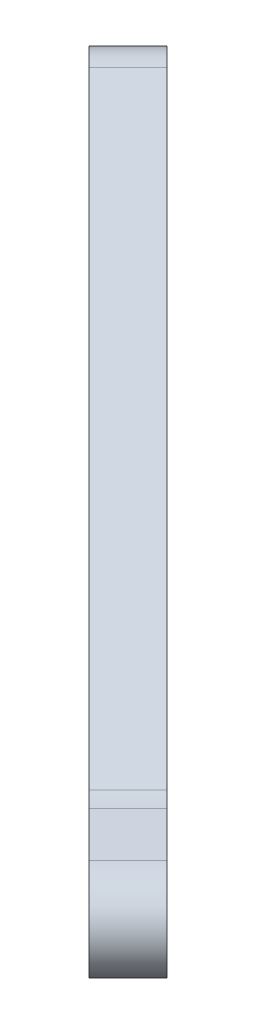
ISO-10303-21;
HEADER;
FILE_DESCRIPTION(('STEP AP214'),'2;1');
FILE_NAME('part.step','',(''),(''),'','','');
FILE_SCHEMA(('AUTOMOTIVE_DESIGN { 1 0 10303 214 1 1 1 1 }'));
ENDSEC;
DATA;
#1=APPLICATION_CONTEXT('core data for automotive mechanical design processes');
#2=APPLICATION_PROTOCOL_DEFINITION('international standard','automotive_design',2000,#1);
#3=PRODUCT_CONTEXT('',#1,'mechanical');
#4=PRODUCT('Part','Part','',(#3));
#5=PRODUCT_RELATED_PRODUCT_CATEGORY('part','',(#4));
#6=PRODUCT_DEFINITION_FORMATION('','',#4);
#7=PRODUCT_DEFINITION_CONTEXT('part definition',#1,'design');
#8=PRODUCT_DEFINITION('design','',#6,#7);
#9=PRODUCT_DEFINITION_SHAPE('','',#8);
#10=(LENGTH_UNIT() NAMED_UNIT(*) SI_UNIT(.MILLI.,.METRE.));
#11=(NAMED_UNIT(*) PLANE_ANGLE_UNIT() SI_UNIT($,.RADIAN.));
#12=(NAMED_UNIT(*) SI_UNIT($,.STERADIAN.) SOLID_ANGLE_UNIT());
#13=UNCERTAINTY_MEASURE_WITH_UNIT(LENGTH_MEASURE(1.E-05),#10,'distance_accuracy_value','');
#14=(GEOMETRIC_REPRESENTATION_CONTEXT(3) GLOBAL_UNCERTAINTY_ASSIGNED_CONTEXT((#13)) GLOBAL_UNIT_ASSIGNED_CONTEXT((#10,
#11,#12)) REPRESENTATION_CONTEXT('',''));
#15=CARTESIAN_POINT('',(0.,0.,0.));
#16=DIRECTION('',(0.,0.,1.));
#17=DIRECTION('',(1.,0.,0.));
#18=AXIS2_PLACEMENT_3D('',#15,#16,#17);
#19=CARTESIAN_POINT('',(-52.7599580016663,-1.60288568297003,29.4826826854525));
#20=DIRECTION('',(0.707106781186551,0.,-0.707106781186544));
#21=DIRECTION('',(-0.707106781186544,0.,-0.707106781186551));
#22=AXIS2_PLACEMENT_3D('',#19,#20,#21);
#23=CYLINDRICAL_SURFACE('',#22,4.);
#24=CARTESIAN_POINT('',(-50.6386376581066,-1.60288568297003,27.3613623418928));
#25=DIRECTION('',(0.707106781186551,0.,-0.707106781186544));
#26=DIRECTION('',(-0.707106781186544,0.,-0.707106781186551));
#27=AXIS2_PLACEMENT_3D('',#24,#25,#26);
#28=CIRCLE('',#27,4.);
#29=CARTESIAN_POINT('',(-52.1460159613578,1.78172970164536,25.8539840386417));
#30=VERTEX_POINT('',#29);
#31=CARTESIAN_POINT('',(-48.4679129448013,0.961467732238384,29.5320870551982));
#32=VERTEX_POINT('',#31);
#33=EDGE_CURVE('E155',#30,#32,#28,.T.);
#34=ORIENTED_EDGE('',*,*,#33,.T.);
#35=DIRECTION('',(0.707106781186551,0.,-0.707106781186544));
#36=VECTOR('',#35,1.);
#37=CARTESIAN_POINT('',(-50.589233288361,0.961467732238385,31.6534073987578));
#38=LINE('',#37,#36);
#39=CARTESIAN_POINT('',(-50.589233288361,0.961467732238385,31.6534073987578));
#40=VERTEX_POINT('',#39);
#41=EDGE_CURVE('E53',#32,#40,#38,.F.);
#42=ORIENTED_EDGE('',*,*,#41,.T.);
#43=CARTESIAN_POINT('',(-52.7599580016663,-1.60288568297003,29.4826826854525));
#44=DIRECTION('',(0.707106781186551,0.,-0.707106781186544));
#45=DIRECTION('',(-0.707106781186544,0.,-0.707106781186551));
#46=AXIS2_PLACEMENT_3D('',#43,#44,#45);
#47=CIRCLE('',#46,4.);
#48=CARTESIAN_POINT('',(-54.2673363049174,1.78172970164536,27.9753043822013));
#49=VERTEX_POINT('',#48);
#50=EDGE_CURVE('E128',#49,#40,#47,.T.);
#51=ORIENTED_EDGE('',*,*,#50,.F.);
#52=DIRECTION('',(0.707106781186551,0.,-0.707106781186544));
#53=VECTOR('',#52,1.);
#54=CARTESIAN_POINT('',(-54.2673363049174,1.78172970164536,27.9753043822013));
#55=LINE('',#54,#53);
#56=EDGE_CURVE('E117',#49,#30,#55,.T.);
#57=ORIENTED_EDGE('',*,*,#56,.T.);
#58=EDGE_LOOP('',(#34,#42,#51,#57));
#59=FACE_BOUND('',#58,.T.);
#60=ADVANCED_FACE('F38',(#59),#23,.F.);
#61=CARTESIAN_POINT('',(-41.5774177938016,-2.92069575510476,40.6652228933173));
#62=DIRECTION('',(-0.152486267652241,-0.976471134419742,-0.152486267652242));
#63=DIRECTION('',(0.,0.154290605331928,-0.988025510351988));
#64=AXIS2_PLACEMENT_3D('',#61,#62,#63);
#65=PLANE('',#64);
#66=DIRECTION('',(-0.690469360781117,0.215648147789453,-0.690469360781124));
#67=VECTOR('',#66,1.);
#68=CARTESIAN_POINT('',(-39.4560974502419,-2.92069575510476,38.5439025497577));
#69=LINE('',#68,#67);
#70=CARTESIAN_POINT('',(-26.7715239050535,-6.88235567209871,51.2284760949462));
#71=VERTEX_POINT('',#70);
#72=CARTESIAN_POINT('',(-46.5169383914309,-0.715446170849808,31.4830616085686));
#73=VERTEX_POINT('',#72);
#74=EDGE_CURVE('E169',#71,#73,#69,.T.);
#75=ORIENTED_EDGE('',*,*,#74,.F.);
#76=DIRECTION('',(0.707106781186551,0.,-0.707106781186544));
#77=VECTOR('',#76,1.);
#78=CARTESIAN_POINT('',(-28.8928442486132,-6.88235567209871,53.3497964385059));
#79=LINE('',#78,#77);
#80=CARTESIAN_POINT('',(-28.8928442486132,-6.88235567209871,53.3497964385059));
#81=VERTEX_POINT('',#80);
#82=EDGE_CURVE('E197',#71,#81,#79,.F.);
#83=ORIENTED_EDGE('',*,*,#82,.T.);
#84=DIRECTION('',(-0.690469360781117,0.215648147789453,-0.690469360781124));
#85=VECTOR('',#84,1.);
#86=CARTESIAN_POINT('',(-41.5774177938016,-2.92069575510476,40.6652228933173));
#87=LINE('',#86,#85);
#88=CARTESIAN_POINT('',(-48.6382587349905,-0.715446170849808,33.6043819521283));
#89=VERTEX_POINT('',#88);
#90=EDGE_CURVE('E148',#81,#89,#87,.T.);
#91=ORIENTED_EDGE('',*,*,#90,.T.);
#92=DIRECTION('',(-0.707106781186551,0.,0.707106781186544));
#93=VECTOR('',#92,1.);
#94=CARTESIAN_POINT('',(-46.5169383914309,-0.71544617084981,31.4830616085686));
#95=LINE('',#94,#93);
#96=EDGE_CURVE('E194',#89,#73,#95,.F.);
#97=ORIENTED_EDGE('',*,*,#96,.T.);
#98=EDGE_LOOP('',(#75,#83,#91,#97));
#99=FACE_BOUND('',#98,.T.);
#100=ADVANCED_FACE('F223',(#99),#65,.T.);
#101=CARTESIAN_POINT('',(-41.1213203435597,-7.,41.1213203435592));
#102=DIRECTION('',(0.,-1.,0.));
#103=DIRECTION('',(0.,0.,-1.));
#104=AXIS2_PLACEMENT_3D('',#101,#102,#103);
#105=PLANE('',#104);
#106=DIRECTION('',(-0.707106781186544,0.,-0.707106781186551));
#107=VECTOR('',#106,1.);
#108=CARTESIAN_POINT('',(-41.1213203435597,-7.,41.1213203435592));
#109=LINE('',#108,#107);
#110=CARTESIAN_POINT('',(-25.6877396299112,-7.,56.5549010572078));
#111=VERTEX_POINT('',#110);
#112=CARTESIAN_POINT('',(-28.130412910352,-7.,54.1122277767671));
#113=VERTEX_POINT('',#112);
#114=EDGE_CURVE('E145',#111,#113,#109,.T.);
#115=ORIENTED_EDGE('',*,*,#114,.T.);
#116=DIRECTION('',(0.707106781186551,0.,-0.707106781186544));
#117=VECTOR('',#116,1.);
#118=CARTESIAN_POINT('',(-28.130412910352,-7.,54.1122277767671));
#119=LINE('',#118,#117);
#120=CARTESIAN_POINT('',(-26.0090925667923,-7.,51.9909074332074));
#121=VERTEX_POINT('',#120);
#122=EDGE_CURVE('E187',#113,#121,#119,.T.);
#123=ORIENTED_EDGE('',*,*,#122,.T.);
#124=DIRECTION('',(-0.707106781186544,0.,-0.707106781186551));
#125=VECTOR('',#124,1.);
#126=CARTESIAN_POINT('',(-39.,-7.,38.9999999999996));
#127=LINE('',#126,#125);
#128=CARTESIAN_POINT('',(-23.5664192863516,-7.,54.4335807136482));
#129=VERTEX_POINT('',#128);
#130=EDGE_CURVE('E166',#129,#121,#127,.T.);
#131=ORIENTED_EDGE('',*,*,#130,.F.);
#132=DIRECTION('',(0.707106781186551,0.,-0.707106781186544));
#133=VECTOR('',#132,1.);
#134=CARTESIAN_POINT('',(-25.6877396299112,-7.,56.5549010572078));
#135=LINE('',#134,#133);
#136=EDGE_CURVE('E177',#111,#129,#135,.T.);
#137=ORIENTED_EDGE('',*,*,#136,.F.);
#138=EDGE_LOOP('',(#115,#123,#131,#137));
#139=FACE_BOUND('',#138,.T.);
#140=ADVANCED_FACE('F231',(#139),#105,.T.);
#141=CARTESIAN_POINT('',(-25.6877396299112,-4.5,56.5549010572078));
#142=DIRECTION('',(0.707106781186551,0.,-0.707106781186544));
#143=DIRECTION('',(-0.707106781186544,0.,-0.707106781186551));
#144=AXIS2_PLACEMENT_3D('',#141,#142,#143);
#145=CYLINDRICAL_SURFACE('',#144,2.5);
#146=CARTESIAN_POINT('',(-23.5664192863516,-4.5,54.4335807136482));
#147=DIRECTION('',(0.707106781186551,0.,-0.707106781186544));
#148=DIRECTION('',(-0.707106781186544,0.,-0.707106781186551));
#149=AXIS2_PLACEMENT_3D('',#146,#147,#148);
#150=CIRCLE('',#149,2.5);
#151=CARTESIAN_POINT('',(-23.5664192863516,-2.,54.4335807136482));
#152=VERTEX_POINT('',#151);
#153=EDGE_CURVE('E163',#152,#129,#150,.T.);
#154=ORIENTED_EDGE('',*,*,#153,.F.);
#155=DIRECTION('',(0.707106781186551,0.,-0.707106781186544));
#156=VECTOR('',#155,1.);
#157=CARTESIAN_POINT('',(-25.6877396299112,-2.,56.5549010572078));
#158=LINE('',#157,#156);
#159=CARTESIAN_POINT('',(-25.6877396299112,-2.,56.5549010572078));
#160=VERTEX_POINT('',#159);
#161=EDGE_CURVE('E180',#160,#152,#158,.T.);
#162=ORIENTED_EDGE('',*,*,#161,.F.);
#163=CARTESIAN_POINT('',(-25.6877396299112,-4.5,56.5549010572078));
#164=DIRECTION('',(0.707106781186551,0.,-0.707106781186544));
#165=DIRECTION('',(-0.707106781186544,0.,-0.707106781186551));
#166=AXIS2_PLACEMENT_3D('',#163,#164,#165);
#167=CIRCLE('',#166,2.5);
#168=EDGE_CURVE('E142',#160,#111,#167,.T.);
#169=ORIENTED_EDGE('',*,*,#168,.T.);
#170=ORIENTED_EDGE('',*,*,#136,.T.);
#171=EDGE_LOOP('',(#154,#162,#169,#170));
#172=FACE_BOUND('',#171,.T.);
#173=ADVANCED_FACE('F234',(#172),#145,.T.);
#174=CARTESIAN_POINT('',(-41.1213203435597,-2.,41.1213203435592));
#175=DIRECTION('',(0.,-1.,0.));
#176=DIRECTION('',(0.,0.,-1.));
#177=AXIS2_PLACEMENT_3D('',#174,#175,#176);
#178=PLANE('',#177);
#179=DIRECTION('',(-0.707106781186544,0.,-0.707106781186551));
#180=VECTOR('',#179,1.);
#181=CARTESIAN_POINT('',(-39.,-2.,38.9999999999996));
#182=LINE('',#181,#180);
#183=CARTESIAN_POINT('',(-26.003572491512,-2.,51.9964275084878));
#184=VERTEX_POINT('',#183);
#185=EDGE_CURVE('E160',#152,#184,#182,.T.);
#186=ORIENTED_EDGE('',*,*,#185,.T.);
#187=DIRECTION('',(0.707106781186551,0.,-0.707106781186544));
#188=VECTOR('',#187,1.);
#189=CARTESIAN_POINT('',(-28.1248928350716,-2.,54.1177478520474));
#190=LINE('',#189,#188);
#191=CARTESIAN_POINT('',(-28.1248928350716,-2.,54.1177478520474));
#192=VERTEX_POINT('',#191);
#193=EDGE_CURVE('E185',#184,#192,#190,.F.);
#194=ORIENTED_EDGE('',*,*,#193,.T.);
#195=DIRECTION('',(-0.707106781186544,0.,-0.707106781186551));
#196=VECTOR('',#195,1.);
#197=CARTESIAN_POINT('',(-41.1213203435597,-2.,41.1213203435592));
#198=LINE('',#197,#196);
#199=EDGE_CURVE('E137',#160,#192,#198,.T.);
#200=ORIENTED_EDGE('',*,*,#199,.F.);
#201=ORIENTED_EDGE('',*,*,#161,.T.);
#202=EDGE_LOOP('',(#186,#194,#200,#201));
#203=FACE_BOUND('',#202,.T.);
#204=ADVANCED_FACE('F212',(#203),#178,.F.);
#205=CARTESIAN_POINT('',(-40.8203896056377,1.89921329401667,41.4222510814812));
#206=DIRECTION('',(-0.154615890785117,-0.975801133752902,-0.154615890785118));
#207=DIRECTION('',(0.,0.156497830604243,-0.987678302392113));
#208=AXIS2_PLACEMENT_3D('',#205,#206,#207);
#209=PLANE('',#208);
#210=DIRECTION('',(-0.689995598766195,0.21865988970671,-0.689995598766202));
#211=VECTOR('',#210,1.);
#212=CARTESIAN_POINT('',(-40.8203896056377,1.89921329401667,41.4222510814812));
#213=LINE('',#212,#211);
#214=CARTESIAN_POINT('',(-28.8979722889972,-1.87900566876451,53.3446683981218));
#215=VERTEX_POINT('',#214);
#216=CARTESIAN_POINT('',(-54.8229080174867,6.33661715141222,27.4197326696321));
#217=VERTEX_POINT('',#216);
#218=EDGE_CURVE('E134',#215,#217,#213,.T.);
#219=ORIENTED_EDGE('',*,*,#218,.F.);
#220=DIRECTION('',(0.707106781186551,0.,-0.707106781186544));
#221=VECTOR('',#220,1.);
#222=CARTESIAN_POINT('',(-26.7766519454375,-1.87900566876451,51.2233480545622));
#223=LINE('',#222,#221);
#224=CARTESIAN_POINT('',(-26.7766519454376,-1.87900566876451,51.2233480545622));
#225=VERTEX_POINT('',#224);
#226=EDGE_CURVE('E179',#215,#225,#223,.T.);
#227=ORIENTED_EDGE('',*,*,#226,.T.);
#228=DIRECTION('',(-0.689995598766195,0.21865988970671,-0.689995598766202));
#229=VECTOR('',#228,1.);
#230=CARTESIAN_POINT('',(-38.6990692620781,1.89921329401667,39.3009307379215));
#231=LINE('',#230,#229);
#232=CARTESIAN_POINT('',(-52.701587673927,6.33661715141222,25.2984123260724));
#233=VERTEX_POINT('',#232);
#234=EDGE_CURVE('E158',#225,#233,#231,.T.);
#235=ORIENTED_EDGE('',*,*,#234,.T.);
#236=DIRECTION('',(0.707106781186551,0.,-0.707106781186544));
#237=VECTOR('',#236,1.);
#238=CARTESIAN_POINT('',(-54.8229080174867,6.33661715141222,27.4197326696321));
#239=LINE('',#238,#237);
#240=EDGE_CURVE('E125',#217,#233,#239,.T.);
#241=ORIENTED_EDGE('',*,*,#240,.F.);
#242=EDGE_LOOP('',(#219,#227,#235,#241));
#243=FACE_BOUND('',#242,.T.);
#244=ADVANCED_FACE('F218',(#243),#209,.F.);
#245=CARTESIAN_POINT('',(-25.6877396299112,-4.5,56.5549010572078));
#246=DIRECTION('',(0.707106781186551,0.,-0.707106781186544));
#247=DIRECTION('',(-0.707106781186544,0.,-0.707106781186551));
#248=AXIS2_PLACEMENT_3D('',#245,#246,#247);
#249=CYLINDRICAL_SURFACE('',#248,1.);
#250=CARTESIAN_POINT('',(-25.6877396299112,-4.5,56.5549010572078));
#251=DIRECTION('',(0.707106781186551,0.,-0.707106781186544));
#252=DIRECTION('',(-0.707106781186544,0.,-0.707106781186551));
#253=AXIS2_PLACEMENT_3D('',#250,#251,#252);
#254=CIRCLE('',#253,1.);
#255=CARTESIAN_POINT('',(-26.3948464110978,-4.5,55.8477942760212));
#256=VERTEX_POINT('',#255);
#257=EDGE_CURVE('E150',#256,#256,#254,.T.);
#258=CARTESIAN_POINT('',(-23.5664192863516,-4.5,54.4335807136482));
#259=DIRECTION('',(0.707106781186551,0.,-0.707106781186544));
#260=DIRECTION('',(-0.707106781186544,0.,-0.707106781186551));
#261=AXIS2_PLACEMENT_3D('',#258,#259,#260);
#262=CIRCLE('',#261,1.);
#263=CARTESIAN_POINT('',(-24.2735260675381,-4.5,53.7264739324616));
#264=VERTEX_POINT('',#263);
#265=EDGE_CURVE('E172',#264,#264,#262,.T.);
#266=CARTESIAN_POINT('',(-26.3948464110978,-4.5,55.8477942760212));
#267=CARTESIAN_POINT('',(-26.3727493241857,-4.5,55.8256971891092));
#268=CARTESIAN_POINT('',(-26.3506522372736,-4.5,55.8036001021971));
#269=CARTESIAN_POINT('',(-26.3064580634495,-4.5,55.7594059283729));
#270=CARTESIAN_POINT('',(-26.2843609765374,-4.5,55.7373088414609));
#271=CARTESIAN_POINT('',(-26.2401668027132,-4.5,55.6931146676367));
#272=CARTESIAN_POINT('',(-26.2180697158011,-4.5,55.6710175807246));
#273=CARTESIAN_POINT('',(-26.173875541977,-4.5,55.6268234069004));
#274=CARTESIAN_POINT('',(-26.1517784550649,-4.5,55.6047263199884));
#275=CARTESIAN_POINT('',(-26.1075842812408,-4.5,55.5605321461642));
#276=CARTESIAN_POINT('',(-26.0854871943287,-4.5,55.5384350592521));
#277=CARTESIAN_POINT('',(-26.0412930205045,-4.5,55.494240885428));
#278=CARTESIAN_POINT('',(-26.0191959335924,-4.5,55.4721437985159));
#279=CARTESIAN_POINT('',(-25.9750017597683,-4.5,55.4279496246917));
#280=CARTESIAN_POINT('',(-25.9529046728562,-4.5,55.4058525377797));
#281=CARTESIAN_POINT('',(-25.908710499032,-4.5,55.3616583639555));
#282=CARTESIAN_POINT('',(-25.88661341212,-4.5,55.3395612770434));
#283=CARTESIAN_POINT('',(-25.8424192382958,-4.5,55.2953671032193));
#284=CARTESIAN_POINT('',(-25.8203221513837,-4.5,55.2732700163072));
#285=CARTESIAN_POINT('',(-25.7761279775596,-4.5,55.229075842483));
#286=CARTESIAN_POINT('',(-25.7540308906475,-4.5,55.2069787555709));
#287=CARTESIAN_POINT('',(-25.7098367168233,-4.5,55.1627845817468));
#288=CARTESIAN_POINT('',(-25.6877396299112,-4.5,55.1406874948347));
#289=CARTESIAN_POINT('',(-25.6435454560871,-4.5,55.0964933210105));
#290=CARTESIAN_POINT('',(-25.621448369175,-4.5,55.0743962340985));
#291=CARTESIAN_POINT('',(-25.5772541953508,-4.5,55.0302020602743));
#292=CARTESIAN_POINT('',(-25.5551571084388,-4.5,55.0081049733622));
#293=CARTESIAN_POINT('',(-25.5109629346146,-4.5,54.9639107995381));
#294=CARTESIAN_POINT('',(-25.4888658477025,-4.5,54.941813712626));
#295=CARTESIAN_POINT('',(-25.4446716738784,-4.5,54.8976195388018));
#296=CARTESIAN_POINT('',(-25.4225745869663,-4.5,54.8755224518898));
#297=CARTESIAN_POINT('',(-25.3783804131421,-4.5,54.8313282780656));
#298=CARTESIAN_POINT('',(-25.35628332623,-4.5,54.8092311911535));
#299=CARTESIAN_POINT('',(-25.3120891524059,-4.5,54.7650370173293));
#300=CARTESIAN_POINT('',(-25.2899920654938,-4.5,54.7429399304173));
#301=CARTESIAN_POINT('',(-25.2457978916696,-4.5,54.6987457565931));
#302=CARTESIAN_POINT('',(-25.2237008047576,-4.5,54.676648669681));
#303=CARTESIAN_POINT('',(-25.1795066309334,-4.5,54.6324544958569));
#304=CARTESIAN_POINT('',(-25.1574095440213,-4.5,54.6103574089448));
#305=CARTESIAN_POINT('',(-25.1132153701972,-4.5,54.5661632351206));
#306=CARTESIAN_POINT('',(-25.0911182832851,-4.5,54.5440661482086));
#307=CARTESIAN_POINT('',(-25.0469241094609,-4.5,54.4998719743844));
#308=CARTESIAN_POINT('',(-25.0248270225488,-4.5,54.4777748874723));
#309=CARTESIAN_POINT('',(-24.9806328487247,-4.5,54.4335807136482));
#310=CARTESIAN_POINT('',(-24.9585357618126,-4.5,54.4114836267361));
#311=CARTESIAN_POINT('',(-24.9143415879884,-4.5,54.3672894529119));
#312=CARTESIAN_POINT('',(-24.8922445010764,-4.5,54.3451923659998));
#313=CARTESIAN_POINT('',(-24.8480503272522,-4.5,54.3009981921757));
#314=CARTESIAN_POINT('',(-24.8259532403401,-4.5,54.2789011052636));
#315=CARTESIAN_POINT('',(-24.781759066516,-4.5,54.2347069314394));
#316=CARTESIAN_POINT('',(-24.7596619796039,-4.5,54.2126098445274));
#317=CARTESIAN_POINT('',(-24.7154678057797,-4.5,54.1684156707032));
#318=CARTESIAN_POINT('',(-24.6933707188677,-4.5,54.1463185837911));
#319=CARTESIAN_POINT('',(-24.6491765450435,-4.5,54.102124409967));
#320=CARTESIAN_POINT('',(-24.6270794581314,-4.5,54.0800273230549));
#321=CARTESIAN_POINT('',(-24.5828852843072,-4.5,54.0358331492307));
#322=CARTESIAN_POINT('',(-24.5607881973952,-4.5,54.0137360623186));
#323=CARTESIAN_POINT('',(-24.516594023571,-4.5,53.9695418884945));
#324=CARTESIAN_POINT('',(-24.4944969366589,-4.5,53.9474448015824));
#325=CARTESIAN_POINT('',(-24.4503027628348,-4.5,53.9032506277582));
#326=CARTESIAN_POINT('',(-24.4282056759227,-4.5,53.8811535408462));
#327=CARTESIAN_POINT('',(-24.3840115020985,-4.5,53.836959367022));
#328=CARTESIAN_POINT('',(-24.3619144151865,-4.5,53.8148622801099));
#329=CARTESIAN_POINT('',(-24.3177202413623,-4.5,53.7706681062858));
#330=CARTESIAN_POINT('',(-24.2956231544502,-4.5,53.7485710193737));
#331=CARTESIAN_POINT('',(-24.2735260675381,-4.5,53.7264739324616));
#332=B_SPLINE_CURVE_WITH_KNOTS('',3,(#266,#267,#268,#269,#270,#271,#272,#273,#274,#275,#276,
#277,#278,#279,#280,#281,#282,#283,#284,#285,#286,#287,#288,#289,#290,#291,#292,#293,#294,#295,
#296,#297,#298,#299,#300,#301,#302,#303,#304,#305,#306,#307,#308,#309,#310,#311,#312,#313,#314,
#315,#316,#317,#318,#319,#320,#321,#322,#323,#324,#325,#326,#327,#328,#329,#330,#331),
.UNSPECIFIED.,.F.,.F.,(4,2,2,2,2,2,2,2,2,2,2,2,2,2,2,2,2,2,2,2,2,2,2,2,2,2,2,2,2,2,2,2,4),(0.,
0.0937500000000009,0.187499999999997,0.28125,0.375000000000001,0.46875,0.5625,0.656249999999996,
0.75,0.843750000000001,0.937499999999999,1.03125,1.125,1.21875,1.3125,1.40625,1.5,1.59375,
1.6875,1.78125,1.875,1.96875,2.0625,2.15625,2.25,2.34375,2.4375,2.53125,2.625,2.71875,2.8125,
2.90625,3.),.UNSPECIFIED.);
#333=EDGE_CURVE('BSEAM310',#256,#264,#332,.T.);
#334=ORIENTED_EDGE('',*,*,#257,.F.);
#335=ORIENTED_EDGE('',*,*,#265,.T.);
#336=ORIENTED_EDGE('',*,*,#333,.T.);
#337=ORIENTED_EDGE('',*,*,#333,.F.);
#338=EDGE_LOOP('',(#334,#336,#335,#337));
#339=FACE_BOUND('',#338,.T.);
#340=ADVANCED_FACE('F310',(#339),#249,.F.);
#341=CARTESIAN_POINT('',(-55.2094477444494,3.89711431702997,27.0331929426693));
#342=DIRECTION('',(0.707106781186551,0.,-0.707106781186544));
#343=DIRECTION('',(-0.707106781186544,0.,-0.707106781186551));
#344=AXIS2_PLACEMENT_3D('',#341,#342,#343);
#345=CYLINDRICAL_SURFACE('',#344,2.5);
#346=CARTESIAN_POINT('',(-53.0881274008898,3.89711431702997,24.9118725991097));
#347=DIRECTION('',(0.707106781186551,0.,-0.707106781186544));
#348=DIRECTION('',(-0.707106781186544,0.,-0.707106781186551));
#349=AXIS2_PLACEMENT_3D('',#346,#347,#348);
#350=CIRCLE('',#349,2.5);
#351=EDGE_CURVE('E123',#30,#233,#350,.T.);
#352=ORIENTED_EDGE('',*,*,#351,.F.);
#353=ORIENTED_EDGE('',*,*,#56,.F.);
#354=CARTESIAN_POINT('',(-55.2094477444494,3.89711431702997,27.0331929426693));
#355=DIRECTION('',(0.707106781186551,0.,-0.707106781186544));
#356=DIRECTION('',(-0.707106781186544,0.,-0.707106781186551));
#357=AXIS2_PLACEMENT_3D('',#354,#355,#356);
#358=CIRCLE('',#357,2.5);
#359=EDGE_CURVE('E121',#49,#217,#358,.T.);
#360=ORIENTED_EDGE('',*,*,#359,.T.);
#361=ORIENTED_EDGE('',*,*,#240,.T.);
#362=EDGE_LOOP('',(#352,#353,#360,#361));
#363=FACE_BOUND('',#362,.T.);
#364=ADVANCED_FACE('F118',(#363),#345,.T.);
#365=CARTESIAN_POINT('',(-55.2094477444494,3.89711431702997,27.0331929426693));
#366=DIRECTION('',(0.707106781186551,0.,-0.707106781186544));
#367=DIRECTION('',(-0.707106781186544,0.,-0.707106781186551));
#368=AXIS2_PLACEMENT_3D('',#365,#366,#367);
#369=CYLINDRICAL_SURFACE('',#368,1.00000000000001);
#370=CARTESIAN_POINT('',(-55.2094477444494,3.89711431702997,27.0331929426693));
#371=DIRECTION('',(0.707106781186551,0.,-0.707106781186544));
#372=DIRECTION('',(-0.707106781186544,0.,-0.707106781186551));
#373=AXIS2_PLACEMENT_3D('',#370,#371,#372);
#374=CIRCLE('',#373,1.00000000000001);
#375=CARTESIAN_POINT('',(-55.916554525636,3.89711431702997,26.3260861614827));
#376=VERTEX_POINT('',#375);
#377=EDGE_CURVE('E126',#376,#376,#374,.T.);
#378=CARTESIAN_POINT('',(-53.0881274008898,3.89711431702997,24.9118725991097));
#379=DIRECTION('',(0.707106781186551,0.,-0.707106781186544));
#380=DIRECTION('',(-0.707106781186544,0.,-0.707106781186551));
#381=AXIS2_PLACEMENT_3D('',#378,#379,#380);
#382=CIRCLE('',#381,1.00000000000001);
#383=CARTESIAN_POINT('',(-53.7952341820763,3.89711431702997,24.2047658179231));
#384=VERTEX_POINT('',#383);
#385=EDGE_CURVE('E129',#384,#384,#382,.T.);
#386=CARTESIAN_POINT('',(-55.916554525636,3.89711431702997,26.3260861614827));
#387=CARTESIAN_POINT('',(-55.8944574387239,3.89711431702997,26.3039890745707));
#388=CARTESIAN_POINT('',(-55.8723603518118,3.89711431702997,26.2818919876586));
#389=CARTESIAN_POINT('',(-55.8281661779877,3.89711431702997,26.2376978138344));
#390=CARTESIAN_POINT('',(-55.8060690910756,3.89711431702997,26.2156007269223));
#391=CARTESIAN_POINT('',(-55.7618749172514,3.89711431702997,26.1714065530982));
#392=CARTESIAN_POINT('',(-55.7397778303393,3.89711431702997,26.1493094661861));
#393=CARTESIAN_POINT('',(-55.6955836565152,3.89711431702997,26.1051152923619));
#394=CARTESIAN_POINT('',(-55.6734865696031,3.89711431702997,26.0830182054499));
#395=CARTESIAN_POINT('',(-55.6292923957789,3.89711431702997,26.0388240316257));
#396=CARTESIAN_POINT('',(-55.6071953088669,3.89711431702997,26.0167269447136));
#397=CARTESIAN_POINT('',(-55.5630011350427,3.89711431702997,25.9725327708895));
#398=CARTESIAN_POINT('',(-55.5409040481306,3.89711431702997,25.9504356839774));
#399=CARTESIAN_POINT('',(-55.4967098743065,3.89711431702997,25.9062415101532));
#400=CARTESIAN_POINT('',(-55.4746127873944,3.89711431702997,25.8841444232411));
#401=CARTESIAN_POINT('',(-55.4304186135702,3.89711431702997,25.839950249417));
#402=CARTESIAN_POINT('',(-55.4083215266581,3.89711431702997,25.8178531625049));
#403=CARTESIAN_POINT('',(-55.364127352834,3.89711431702997,25.7736589886807));
#404=CARTESIAN_POINT('',(-55.3420302659219,3.89711431702997,25.7515619017687));
#405=CARTESIAN_POINT('',(-55.2978360920977,3.89711431702997,25.7073677279445));
#406=CARTESIAN_POINT('',(-55.2757390051857,3.89711431702997,25.6852706410324));
#407=CARTESIAN_POINT('',(-55.2315448313615,3.89711431702997,25.6410764672083));
#408=CARTESIAN_POINT('',(-55.2094477444494,3.89711431702997,25.6189793802962));
#409=CARTESIAN_POINT('',(-55.1652535706253,3.89711431702997,25.574785206472));
#410=CARTESIAN_POINT('',(-55.1431564837132,3.89711431702997,25.5526881195599));
#411=CARTESIAN_POINT('',(-55.098962309889,3.89711431702997,25.5084939457358));
#412=CARTESIAN_POINT('',(-55.076865222977,3.89711431702997,25.4863968588237));
#413=CARTESIAN_POINT('',(-55.0326710491528,3.89711431702997,25.4422026849996));
#414=CARTESIAN_POINT('',(-55.0105739622407,3.89711431702997,25.4201055980875));
#415=CARTESIAN_POINT('',(-54.9663797884166,3.89711431702997,25.3759114242633));
#416=CARTESIAN_POINT('',(-54.9442827015045,3.89711431702997,25.3538143373512));
#417=CARTESIAN_POINT('',(-54.9000885276803,3.89711431702997,25.3096201635271));
#418=CARTESIAN_POINT('',(-54.8779914407682,3.89711431702997,25.287523076615));
#419=CARTESIAN_POINT('',(-54.8337972669441,3.89711431702997,25.2433289027908));
#420=CARTESIAN_POINT('',(-54.811700180032,3.89711431702997,25.2212318158788));
#421=CARTESIAN_POINT('',(-54.7675060062078,3.89711431702997,25.1770376420546));
#422=CARTESIAN_POINT('',(-54.7454089192958,3.89711431702997,25.1549405551425));
#423=CARTESIAN_POINT('',(-54.7012147454716,3.89711431702997,25.1107463813184));
#424=CARTESIAN_POINT('',(-54.6791176585595,3.89711431702997,25.0886492944063));
#425=CARTESIAN_POINT('',(-54.6349234847354,3.89711431702997,25.0444551205821));
#426=CARTESIAN_POINT('',(-54.6128263978233,3.89711431702997,25.02235803367));
#427=CARTESIAN_POINT('',(-54.5686322239991,3.89711431702997,24.9781638598459));
#428=CARTESIAN_POINT('',(-54.546535137087,3.89711431702997,24.9560667729338));
#429=CARTESIAN_POINT('',(-54.5023409632629,3.89711431702997,24.9118725991096));
#430=CARTESIAN_POINT('',(-54.4802438763508,3.89711431702997,24.8897755121976));
#431=CARTESIAN_POINT('',(-54.4360497025266,3.89711431702997,24.8455813383734));
#432=CARTESIAN_POINT('',(-54.4139526156146,3.89711431702997,24.8234842514613));
#433=CARTESIAN_POINT('',(-54.3697584417904,3.89711431702997,24.7792900776372));
#434=CARTESIAN_POINT('',(-54.3476613548783,3.89711431702997,24.7571929907251));
#435=CARTESIAN_POINT('',(-54.3034671810542,3.89711431702997,24.7129988169009));
#436=CARTESIAN_POINT('',(-54.2813700941421,3.89711431702997,24.6909017299888));
#437=CARTESIAN_POINT('',(-54.2371759203179,3.89711431702997,24.6467075561647));
#438=CARTESIAN_POINT('',(-54.2150788334058,3.89711431702997,24.6246104692526));
#439=CARTESIAN_POINT('',(-54.1708846595817,3.89711431702997,24.5804162954284));
#440=CARTESIAN_POINT('',(-54.1487875726696,3.89711431702997,24.5583192085164));
#441=CARTESIAN_POINT('',(-54.1045933988455,3.89711431702997,24.5141250346922));
#442=CARTESIAN_POINT('',(-54.0824963119334,3.89711431702997,24.4920279477801));
#443=CARTESIAN_POINT('',(-54.0383021381092,3.89711431702997,24.447833773956));
#444=CARTESIAN_POINT('',(-54.0162050511971,3.89711431702997,24.4257366870439));
#445=CARTESIAN_POINT('',(-53.972010877373,3.89711431702997,24.3815425132197));
#446=CARTESIAN_POINT('',(-53.9499137904609,3.89711431702997,24.3594454263077));
#447=CARTESIAN_POINT('',(-53.9057196166367,3.89711431702997,24.3152512524835));
#448=CARTESIAN_POINT('',(-53.8836225297247,3.89711431702997,24.2931541655714));
#449=CARTESIAN_POINT('',(-53.8394283559005,3.89711431702997,24.2489599917473));
#450=CARTESIAN_POINT('',(-53.8173312689884,3.89711431702997,24.2268629048352));
#451=CARTESIAN_POINT('',(-53.7952341820763,3.89711431702997,24.2047658179231));
#452=B_SPLINE_CURVE_WITH_KNOTS('',3,(#386,#387,#388,#389,#390,#391,#392,#393,#394,#395,#396,
#397,#398,#399,#400,#401,#402,#403,#404,#405,#406,#407,#408,#409,#410,#411,#412,#413,#414,#415,
#416,#417,#418,#419,#420,#421,#422,#423,#424,#425,#426,#427,#428,#429,#430,#431,#432,#433,#434,
#435,#436,#437,#438,#439,#440,#441,#442,#443,#444,#445,#446,#447,#448,#449,#450,#451),
.UNSPECIFIED.,.F.,.F.,(4,2,2,2,2,2,2,2,2,2,2,2,2,2,2,2,2,2,2,2,2,2,2,2,2,2,2,2,2,2,2,2,4),(0.,
0.0937500000000033,0.187500000000004,0.28125,0.375000000000001,0.468750000000004,
0.562500000000005,0.656250000000001,0.750000000000002,0.843750000000003,0.937500000000002,
1.03125,1.125,1.21875,1.3125,1.40625,1.5,1.59375,1.6875,1.78125,1.875,1.96875,2.0625,
2.15625000000001,2.25,2.34375,2.4375,2.53125,2.625,2.71875,2.81250000000001,2.90625,
3.00000000000001),.UNSPECIFIED.);
#453=EDGE_CURVE('BSEAM292',#376,#384,#452,.T.);
#454=ORIENTED_EDGE('',*,*,#377,.F.);
#455=ORIENTED_EDGE('',*,*,#385,.T.);
#456=ORIENTED_EDGE('',*,*,#453,.T.);
#457=ORIENTED_EDGE('',*,*,#453,.F.);
#458=EDGE_LOOP('',(#454,#456,#455,#457));
#459=FACE_BOUND('',#458,.T.);
#460=ADVANCED_FACE('F292',(#459),#369,.F.);
#461=CARTESIAN_POINT('',(-41.1213203435597,0.,41.1213203435592));
#462=DIRECTION('',(0.707106781186551,0.,-0.707106781186544));
#463=DIRECTION('',(-0.707106781186544,0.,-0.707106781186551));
#464=AXIS2_PLACEMENT_3D('',#461,#462,#463);
#465=PLANE('',#464);
#466=ORIENTED_EDGE('',*,*,#90,.F.);
#467=CARTESIAN_POINT('',(-28.130412910352,-2.,54.1122277767671));
#468=DIRECTION('',(0.707106781186551,0.,-0.707106781186544));
#469=DIRECTION('',(-0.707106781186544,0.,-0.707106781186551));
#470=AXIS2_PLACEMENT_3D('',#467,#468,#469);
#471=CIRCLE('',#470,5.);
#472=EDGE_CURVE('E200',#81,#113,#471,.F.);
#473=ORIENTED_EDGE('',*,*,#472,.T.);
#474=ORIENTED_EDGE('',*,*,#114,.F.);
#475=ORIENTED_EDGE('',*,*,#168,.F.);
#476=ORIENTED_EDGE('',*,*,#199,.T.);
#477=CARTESIAN_POINT('',(-28.1248928350716,3.,54.1177478520474));
#478=DIRECTION('',(0.707106781186551,0.,-0.707106781186544));
#479=DIRECTION('',(-0.707106781186544,0.,-0.707106781186551));
#480=AXIS2_PLACEMENT_3D('',#477,#478,#479);
#481=CIRCLE('',#480,5.);
#482=EDGE_CURVE('E11',#192,#215,#481,.T.);
#483=ORIENTED_EDGE('',*,*,#482,.T.);
#484=ORIENTED_EDGE('',*,*,#218,.T.);
#485=ORIENTED_EDGE('',*,*,#359,.F.);
#486=ORIENTED_EDGE('',*,*,#50,.T.);
#487=CARTESIAN_POINT('',(-47.8758273967293,4.1669095012489,34.3668132903895));
#488=DIRECTION('',(0.707106781186551,0.,-0.707106781186544));
#489=DIRECTION('',(-0.707106781186544,0.,-0.707106781186551));
#490=AXIS2_PLACEMENT_3D('',#487,#488,#489);
#491=CIRCLE('',#490,5.);
#492=EDGE_CURVE('E60',#40,#89,#491,.F.);
#493=ORIENTED_EDGE('',*,*,#492,.T.);
#494=EDGE_LOOP('',(#466,#473,#474,#475,#476,#483,#484,#485,#486,#493));
#495=FACE_BOUND('',#494,.T.);
#496=ORIENTED_EDGE('',*,*,#257,.T.);
#497=EDGE_LOOP('',(#496));
#498=FACE_BOUND('',#497,.T.);
#499=ORIENTED_EDGE('',*,*,#377,.T.);
#500=EDGE_LOOP('',(#499));
#501=FACE_BOUND('',#500,.T.);
#502=ADVANCED_FACE('F131',(#495,#498,#501),#465,.F.);
#503=CARTESIAN_POINT('',(-39.,0.,38.9999999999996));
#504=DIRECTION('',(0.707106781186551,0.,-0.707106781186544));
#505=DIRECTION('',(-0.707106781186544,0.,-0.707106781186551));
#506=AXIS2_PLACEMENT_3D('',#503,#504,#505);
#507=PLANE('',#506);
#508=ORIENTED_EDGE('',*,*,#130,.T.);
#509=CARTESIAN_POINT('',(-26.0090925667923,-2.,51.9909074332074));
#510=DIRECTION('',(0.707106781186551,0.,-0.707106781186544));
#511=DIRECTION('',(-0.707106781186544,0.,-0.707106781186551));
#512=AXIS2_PLACEMENT_3D('',#509,#510,#511);
#513=CIRCLE('',#512,5.);
#514=EDGE_CURVE('E192',#121,#71,#513,.T.);
#515=ORIENTED_EDGE('',*,*,#514,.T.);
#516=ORIENTED_EDGE('',*,*,#74,.T.);
#517=CARTESIAN_POINT('',(-45.7545070531697,4.1669095012489,32.2454929468298));
#518=DIRECTION('',(0.707106781186551,0.,-0.707106781186544));
#519=DIRECTION('',(-0.707106781186544,0.,-0.707106781186551));
#520=AXIS2_PLACEMENT_3D('',#517,#518,#519);
#521=CIRCLE('',#520,5.);
#522=EDGE_CURVE('E190',#73,#32,#521,.T.);
#523=ORIENTED_EDGE('',*,*,#522,.T.);
#524=ORIENTED_EDGE('',*,*,#33,.F.);
#525=ORIENTED_EDGE('',*,*,#351,.T.);
#526=ORIENTED_EDGE('',*,*,#234,.F.);
#527=CARTESIAN_POINT('',(-26.003572491512,3.,51.9964275084878));
#528=DIRECTION('',(0.707106781186551,0.,-0.707106781186544));
#529=DIRECTION('',(-0.707106781186544,0.,-0.707106781186551));
#530=AXIS2_PLACEMENT_3D('',#527,#528,#529);
#531=CIRCLE('',#530,5.);
#532=EDGE_CURVE('E46',#225,#184,#531,.F.);
#533=ORIENTED_EDGE('',*,*,#532,.T.);
#534=ORIENTED_EDGE('',*,*,#185,.F.);
#535=ORIENTED_EDGE('',*,*,#153,.T.);
#536=EDGE_LOOP('',(#508,#515,#516,#523,#524,#525,#526,#533,#534,#535));
#537=FACE_BOUND('',#536,.T.);
#538=ORIENTED_EDGE('',*,*,#265,.F.);
#539=EDGE_LOOP('',(#538));
#540=FACE_BOUND('',#539,.T.);
#541=ORIENTED_EDGE('',*,*,#385,.F.);
#542=EDGE_LOOP('',(#541));
#543=FACE_BOUND('',#542,.T.);
#544=ADVANCED_FACE('F205',(#537,#540,#543),#507,.T.);
#545=CARTESIAN_POINT('',(-28.1248928350716,3.,54.1177478520474));
#546=DIRECTION('',(-0.707106781186551,0.,0.707106781186544));
#547=DIRECTION('',(0.707106781186544,0.,0.707106781186551));
#548=AXIS2_PLACEMENT_3D('',#545,#546,#547);
#549=CYLINDRICAL_SURFACE('',#548,5.);
#550=ORIENTED_EDGE('',*,*,#482,.F.);
#551=ORIENTED_EDGE('',*,*,#193,.F.);
#552=ORIENTED_EDGE('',*,*,#532,.F.);
#553=ORIENTED_EDGE('',*,*,#226,.F.);
#554=EDGE_LOOP('',(#550,#551,#552,#553));
#555=FACE_BOUND('',#554,.T.);
#556=ADVANCED_FACE('F215',(#555),#549,.F.);
#557=CARTESIAN_POINT('',(-28.130412910352,-2.,54.1122277767671));
#558=DIRECTION('',(0.707106781186551,0.,-0.707106781186544));
#559=DIRECTION('',(-0.707106781186544,0.,-0.707106781186551));
#560=AXIS2_PLACEMENT_3D('',#557,#558,#559);
#561=CYLINDRICAL_SURFACE('',#560,5.);
#562=ORIENTED_EDGE('',*,*,#472,.F.);
#563=ORIENTED_EDGE('',*,*,#82,.F.);
#564=ORIENTED_EDGE('',*,*,#514,.F.);
#565=ORIENTED_EDGE('',*,*,#122,.F.);
#566=EDGE_LOOP('',(#562,#563,#564,#565));
#567=FACE_BOUND('',#566,.T.);
#568=ADVANCED_FACE('F229',(#567),#561,.T.);
#569=CARTESIAN_POINT('',(-47.8758273967293,4.1669095012489,34.3668132903895));
#570=DIRECTION('',(0.707106781186551,0.,-0.707106781186544));
#571=DIRECTION('',(-0.707106781186544,0.,-0.707106781186551));
#572=AXIS2_PLACEMENT_3D('',#569,#570,#571);
#573=CYLINDRICAL_SURFACE('',#572,5.);
#574=ORIENTED_EDGE('',*,*,#492,.F.);
#575=ORIENTED_EDGE('',*,*,#41,.F.);
#576=ORIENTED_EDGE('',*,*,#522,.F.);
#577=ORIENTED_EDGE('',*,*,#96,.F.);
#578=EDGE_LOOP('',(#574,#575,#576,#577));
#579=FACE_BOUND('',#578,.T.);
#580=ADVANCED_FACE('F40',(#579),#573,.T.);
#581=CLOSED_SHELL('',(#60,#100,#140,#173,#204,#244,#340,#364,#460,#502,#544,#556,#568,#580));
#582=MANIFOLD_SOLID_BREP('B2',#581);
#583=ADVANCED_BREP_SHAPE_REPRESENTATION('',(#18,#582),#14);
#584=SHAPE_DEFINITION_REPRESENTATION(#9,#583);
ENDSEC;
END-ISO-10303-21;
